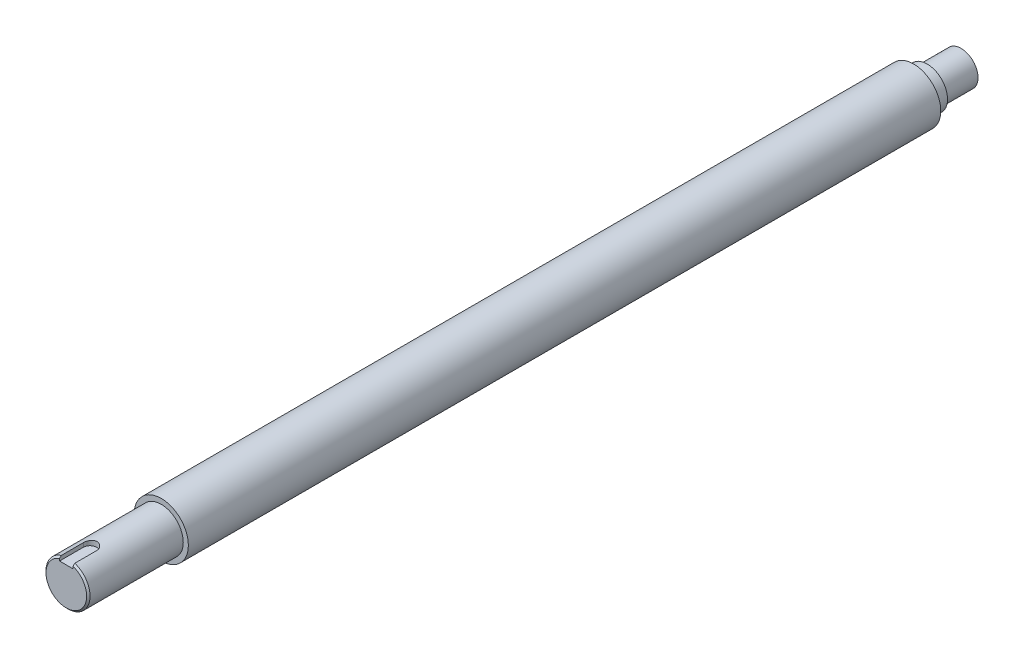
ISO-10303-21;
HEADER;
FILE_DESCRIPTION(('STEP AP214'),'2;1');
FILE_NAME('part.step','',(''),(''),'','','');
FILE_SCHEMA(('AUTOMOTIVE_DESIGN { 1 0 10303 214 1 1 1 1 }'));
ENDSEC;
DATA;
#1=APPLICATION_CONTEXT('core data for automotive mechanical design processes');
#2=APPLICATION_PROTOCOL_DEFINITION('international standard','automotive_design',2000,#1);
#3=PRODUCT_CONTEXT('',#1,'mechanical');
#4=PRODUCT('Part','Part','',(#3));
#5=PRODUCT_RELATED_PRODUCT_CATEGORY('part','',(#4));
#6=PRODUCT_DEFINITION_FORMATION('','',#4);
#7=PRODUCT_DEFINITION_CONTEXT('part definition',#1,'design');
#8=PRODUCT_DEFINITION('design','',#6,#7);
#9=PRODUCT_DEFINITION_SHAPE('','',#8);
#10=(LENGTH_UNIT() NAMED_UNIT(*) SI_UNIT(.MILLI.,.METRE.));
#11=(NAMED_UNIT(*) PLANE_ANGLE_UNIT() SI_UNIT($,.RADIAN.));
#12=(NAMED_UNIT(*) SI_UNIT($,.STERADIAN.) SOLID_ANGLE_UNIT());
#13=UNCERTAINTY_MEASURE_WITH_UNIT(LENGTH_MEASURE(1.E-05),#10,'distance_accuracy_value','');
#14=(GEOMETRIC_REPRESENTATION_CONTEXT(3) GLOBAL_UNCERTAINTY_ASSIGNED_CONTEXT((#13)) GLOBAL_UNIT_ASSIGNED_CONTEXT((#10,
#11,#12)) REPRESENTATION_CONTEXT('',''));
#15=CARTESIAN_POINT('',(0.,0.,0.));
#16=DIRECTION('',(0.,0.,1.));
#17=DIRECTION('',(1.,0.,0.));
#18=AXIS2_PLACEMENT_3D('',#15,#16,#17);
#19=CARTESIAN_POINT('',(0.,0.,-59.));
#20=DIRECTION('',(0.,0.,-1.));
#21=DIRECTION('',(-1.,0.,0.));
#22=AXIS2_PLACEMENT_3D('',#19,#20,#21);
#23=CYLINDRICAL_SURFACE('',#22,3.);
#24=CARTESIAN_POINT('',(0.,0.,-59.));
#25=DIRECTION('',(0.,0.,-1.));
#26=DIRECTION('',(-1.,0.,0.));
#27=AXIS2_PLACEMENT_3D('',#24,#25,#26);
#28=CIRCLE('',#27,3.);
#29=CARTESIAN_POINT('',(-3.,0.,-59.));
#30=VERTEX_POINT('',#29);
#31=EDGE_CURVE('E208',#30,#30,#28,.T.);
#32=ORIENTED_EDGE('',*,*,#31,.T.);
#33=EDGE_LOOP('',(#32));
#34=FACE_BOUND('',#33,.T.);
#35=CARTESIAN_POINT('',(0.,0.,-61.));
#36=DIRECTION('',(0.,0.,-1.));
#37=DIRECTION('',(-1.,0.,0.));
#38=AXIS2_PLACEMENT_3D('',#35,#36,#37);
#39=CIRCLE('',#38,3.);
#40=CARTESIAN_POINT('',(-3.,0.,-61.));
#41=VERTEX_POINT('',#40);
#42=EDGE_CURVE('E47',#41,#41,#39,.F.);
#43=ORIENTED_EDGE('',*,*,#42,.T.);
#44=EDGE_LOOP('',(#43));
#45=FACE_BOUND('',#44,.T.);
#46=ADVANCED_FACE('F41',(#34,#45),#23,.T.);
#47=CARTESIAN_POINT('',(0.,0.,66.));
#48=DIRECTION('',(0.,0.,-1.));
#49=DIRECTION('',(-1.,0.,0.));
#50=AXIS2_PLACEMENT_3D('',#47,#48,#49);
#51=CYLINDRICAL_SURFACE('',#50,4.);
#52=CARTESIAN_POINT('',(0.,0.,52.));
#53=DIRECTION('',(0.,0.,1.));
#54=DIRECTION('',(1.,0.,0.));
#55=AXIS2_PLACEMENT_3D('',#52,#53,#54);
#56=CIRCLE('',#55,4.);
#57=CARTESIAN_POINT('',(4.,0.,52.));
#58=VERTEX_POINT('',#57);
#59=EDGE_CURVE('E253',#58,#58,#56,.T.);
#60=ORIENTED_EDGE('',*,*,#59,.F.);
#61=EDGE_LOOP('',(#60));
#62=FACE_BOUND('',#61,.T.);
#63=CARTESIAN_POINT('',(0.,0.,-59.));
#64=DIRECTION('',(0.,0.,-1.));
#65=DIRECTION('',(-1.,0.,0.));
#66=AXIS2_PLACEMENT_3D('',#63,#64,#65);
#67=CIRCLE('',#66,4.);
#68=CARTESIAN_POINT('',(-4.,0.,-59.));
#69=VERTEX_POINT('',#68);
#70=EDGE_CURVE('E212',#69,#69,#67,.T.);
#71=ORIENTED_EDGE('',*,*,#70,.F.);
#72=EDGE_LOOP('',(#71));
#73=FACE_BOUND('',#72,.T.);
#74=ADVANCED_FACE('F325',(#62,#73),#51,.T.);
#75=CARTESIAN_POINT('',(0.,0.,52.));
#76=DIRECTION('',(0.,0.,1.));
#77=DIRECTION('',(1.,0.,0.));
#78=AXIS2_PLACEMENT_3D('',#75,#76,#77);
#79=PLANE('',#78);
#80=CARTESIAN_POINT('',(0.,0.,52.));
#81=DIRECTION('',(0.,0.,1.));
#82=DIRECTION('',(1.,0.,0.));
#83=AXIS2_PLACEMENT_3D('',#80,#81,#82);
#84=CIRCLE('',#83,3.25);
#85=CARTESIAN_POINT('',(3.25,0.,52.));
#86=VERTEX_POINT('',#85);
#87=EDGE_CURVE('E249',#86,#86,#84,.T.);
#88=ORIENTED_EDGE('',*,*,#87,.F.);
#89=EDGE_LOOP('',(#88));
#90=FACE_BOUND('',#89,.T.);
#91=ORIENTED_EDGE('',*,*,#59,.T.);
#92=EDGE_LOOP('',(#91));
#93=FACE_BOUND('',#92,.T.);
#94=ADVANCED_FACE('F331',(#90,#93),#79,.T.);
#95=CARTESIAN_POINT('',(0.,0.,52.));
#96=DIRECTION('',(0.,0.,1.));
#97=DIRECTION('',(1.,0.,0.));
#98=AXIS2_PLACEMENT_3D('',#95,#96,#97);
#99=CYLINDRICAL_SURFACE('',#98,3.25);
#100=DIRECTION('',(0.,0.,1.));
#101=VECTOR('',#100,1.);
#102=CARTESIAN_POINT('',(0.999999999999998,3.09232921921325,52.));
#103=LINE('',#102,#101);
#104=CARTESIAN_POINT('',(0.999999999999998,3.09232921921325,65.75));
#105=VERTEX_POINT('',#104);
#106=CARTESIAN_POINT('',(1.,3.09232921921325,62.5));
#107=VERTEX_POINT('',#106);
#108=EDGE_CURVE('E246',#105,#107,#103,.F.);
#109=ORIENTED_EDGE('',*,*,#108,.F.);
#110=CARTESIAN_POINT('',(0.,0.,65.75));
#111=DIRECTION('',(0.,0.,1.));
#112=DIRECTION('',(1.,0.,0.));
#113=AXIS2_PLACEMENT_3D('',#110,#111,#112);
#114=CIRCLE('',#113,3.25);
#115=CARTESIAN_POINT('',(-1.,3.09232921921325,65.75));
#116=VERTEX_POINT('',#115);
#117=EDGE_CURVE('E53',#105,#116,#114,.F.);
#118=ORIENTED_EDGE('',*,*,#117,.T.);
#119=DIRECTION('',(0.,0.,1.));
#120=VECTOR('',#119,1.);
#121=CARTESIAN_POINT('',(-1.,3.09232921921325,52.));
#122=LINE('',#121,#120);
#123=CARTESIAN_POINT('',(-1.,3.09232921921325,62.5));
#124=VERTEX_POINT('',#123);
#125=EDGE_CURVE('E232',#124,#116,#122,.T.);
#126=ORIENTED_EDGE('',*,*,#125,.F.);
#127=CARTESIAN_POINT('',(1.,3.09232921921325,62.5));
#128=CARTESIAN_POINT('',(1.00000060849596,3.09232679496023,62.4725829497504));
#129=CARTESIAN_POINT('',(0.998871734792141,3.09269430709658,62.4451797499895));
#130=CARTESIAN_POINT('',(0.994373412064609,3.0941444484278,62.3905832737382));
#131=CARTESIAN_POINT('',(0.991004488865656,3.09522690979651,62.3633899494972));
#132=CARTESIAN_POINT('',(0.977595798696109,3.09949986780655,62.2825678150966));
#133=CARTESIAN_POINT('',(0.964253807107649,3.10371628374243,62.2295023728819));
#134=CARTESIAN_POINT('',(0.929228381659052,3.11438030643292,62.1265060146676));
#135=CARTESIAN_POINT('',(0.907548236778259,3.12082703334217,62.0765738717617));
#136=CARTESIAN_POINT('',(0.856500010775838,3.13522074286848,61.9810176285365));
#137=CARTESIAN_POINT('',(0.827128097492383,3.14316847275732,61.9353956910912));
#138=CARTESIAN_POINT('',(0.760493273359017,3.15996243444553,61.848273334789));
#139=CARTESIAN_POINT('',(0.723020102927358,3.16882846589433,61.8069375813687));
#140=CARTESIAN_POINT('',(0.641694254495179,3.18629188883384,61.7310245522188));
#141=CARTESIAN_POINT('',(0.597840488986,3.19488923422564,61.6964484309602));
#142=CARTESIAN_POINT('',(0.503813866067312,3.21107350257153,61.6343124865832));
#143=CARTESIAN_POINT('',(0.453523821065542,3.21863422678888,61.6069225781337));
#144=CARTESIAN_POINT('',(0.348781013050185,3.23166087940009,61.561054781655));
#145=CARTESIAN_POINT('',(0.294329371654429,3.2371273698525,61.5425745020803));
#146=CARTESIAN_POINT('',(0.184539950762737,3.2452091704307,61.5155997760943));
#147=CARTESIAN_POINT('',(0.129277690188,3.24790505255448,61.5068225402275));
#148=CARTESIAN_POINT('',(0.0180023906652296,3.25042616236987,61.4986076870213));
#149=CARTESIAN_POINT('',(-0.0380104957837585,3.25025196457789,61.4991682005041));
#150=CARTESIAN_POINT('',(-0.147207085626814,3.24710886024715,61.5094258046145));
#151=CARTESIAN_POINT('',(-0.2004227176965,3.24423373696301,61.5188163052281));
#152=CARTESIAN_POINT('',(-0.304481827411612,3.23612670060402,61.5459649990141));
#153=CARTESIAN_POINT('',(-0.355325178541679,3.23089466199145,61.5637236379056));
#154=CARTESIAN_POINT('',(-0.453913277359841,3.21853426865844,61.6073057352098));
#155=CARTESIAN_POINT('',(-0.501613403920564,3.21138386383479,61.6332236200848));
#156=CARTESIAN_POINT('',(-0.592083305838225,3.19594221724746,61.692313030734));
#157=CARTESIAN_POINT('',(-0.634851917166405,3.18765070714765,61.7254862637209));
#158=CARTESIAN_POINT('',(-0.716070212245402,3.17041599968066,61.7997208296557));
#159=CARTESIAN_POINT('',(-0.754275837989609,3.16146000668147,61.8410465424395));
#160=CARTESIAN_POINT('',(-0.823293213934759,3.14419427267491,61.9296138436671));
#161=CARTESIAN_POINT('',(-0.854102765456965,3.13588472433531,61.9768571849465));
#162=CARTESIAN_POINT('',(-0.90773009492845,3.12078732478245,62.0765989009247));
#163=CARTESIAN_POINT('',(-0.930455726353123,3.11401731778575,62.1291496118682));
#164=CARTESIAN_POINT('',(-0.966633025095809,3.10297988745074,62.2375619076414));
#165=CARTESIAN_POINT('',(-0.980098962678475,3.09870861479558,62.2934182531513));
#166=CARTESIAN_POINT('',(-0.992455073788097,3.09476092233738,62.3748352416119));
#167=CARTESIAN_POINT('',(-0.995283915242962,3.09385116848617,62.3997932990799));
#168=CARTESIAN_POINT('',(-0.999054782773968,3.09263516553557,62.4498299673661));
#169=CARTESIAN_POINT('',(-0.999999517882651,3.09232804995251,62.4749083530511));
#170=CARTESIAN_POINT('',(-1.,3.09232921921325,62.5));
#171=B_SPLINE_CURVE_WITH_KNOTS('',3,(#127,#128,#129,#130,#131,#132,#133,#134,#135,#136,#137,
#138,#139,#140,#141,#142,#143,#144,#145,#146,#147,#148,#149,#150,#151,#152,#153,#154,#155,#156,
#157,#158,#159,#160,#161,#162,#163,#164,#165,#166,#167,#168,#169,#170),.UNSPECIFIED.,.F.,.F.,(4,
2,2,2,2,2,2,2,2,2,2,2,2,2,2,2,2,2,2,2,2,4),(0.,0.0821983553007942,0.164377422331977,
0.328159871578877,0.491877783090292,0.655677417175074,0.82439008821497,0.993131548401804,
1.16556201072749,1.33794616302356,1.50516176736448,1.67234389983585,1.8339275148169,
1.99551973733562,2.15905542194855,2.32262962864499,2.4928073537685,2.66303560624824,
2.83514636286236,3.0069912787304,3.08232880746056,3.15755793499273),.UNSPECIFIED.);
#172=EDGE_CURVE('E261',#107,#124,#171,.T.);
#173=ORIENTED_EDGE('',*,*,#172,.F.);
#174=EDGE_LOOP('',(#109,#118,#126,#173));
#175=FACE_BOUND('',#174,.T.);
#176=ORIENTED_EDGE('',*,*,#87,.T.);
#177=EDGE_LOOP('',(#176));
#178=FACE_BOUND('',#177,.T.);
#179=ADVANCED_FACE('F272',(#175,#178),#99,.T.);
#180=CARTESIAN_POINT('',(0.,0.,66.));
#181=DIRECTION('',(0.,0.,1.));
#182=DIRECTION('',(1.,0.,0.));
#183=AXIS2_PLACEMENT_3D('',#180,#181,#182);
#184=PLANE('',#183);
#185=DIRECTION('',(0.,1.,0.));
#186=VECTOR('',#185,1.);
#187=CARTESIAN_POINT('',(-1.,2.5,66.));
#188=LINE('',#187,#186);
#189=CARTESIAN_POINT('',(-1.,2.5,66.));
#190=VERTEX_POINT('',#189);
#191=CARTESIAN_POINT('',(-1.,2.82842712474618,66.));
#192=VERTEX_POINT('',#191);
#193=EDGE_CURVE('E237',#190,#192,#188,.T.);
#194=ORIENTED_EDGE('',*,*,#193,.T.);
#195=CARTESIAN_POINT('',(0.,0.,66.));
#196=DIRECTION('',(0.,0.,1.));
#197=DIRECTION('',(1.,0.,0.));
#198=AXIS2_PLACEMENT_3D('',#195,#196,#197);
#199=CIRCLE('',#198,2.99999999999999);
#200=CARTESIAN_POINT('',(1.,2.82842712474618,66.));
#201=VERTEX_POINT('',#200);
#202=EDGE_CURVE('E270',#192,#201,#199,.T.);
#203=ORIENTED_EDGE('',*,*,#202,.T.);
#204=DIRECTION('',(0.,1.,0.));
#205=VECTOR('',#204,1.);
#206=CARTESIAN_POINT('',(1.,2.5,66.));
#207=LINE('',#206,#205);
#208=CARTESIAN_POINT('',(1.,2.5,66.));
#209=VERTEX_POINT('',#208);
#210=EDGE_CURVE('E233',#209,#201,#207,.T.);
#211=ORIENTED_EDGE('',*,*,#210,.F.);
#212=DIRECTION('',(-1.,0.,0.));
#213=VECTOR('',#212,1.);
#214=CARTESIAN_POINT('',(0.,2.5,66.));
#215=LINE('',#214,#213);
#216=EDGE_CURVE('E257',#209,#190,#215,.T.);
#217=ORIENTED_EDGE('',*,*,#216,.T.);
#218=EDGE_LOOP('',(#194,#203,#211,#217));
#219=FACE_BOUND('',#218,.T.);
#220=ADVANCED_FACE('F280',(#219),#184,.T.);
#221=CARTESIAN_POINT('',(0.,2.5,62.5));
#222=DIRECTION('',(0.,1.,0.));
#223=DIRECTION('',(0.,0.,1.));
#224=AXIS2_PLACEMENT_3D('',#221,#222,#223);
#225=CYLINDRICAL_SURFACE('',#224,1.);
#226=ORIENTED_EDGE('',*,*,#172,.T.);
#227=DIRECTION('',(0.,1.,0.));
#228=VECTOR('',#227,1.);
#229=CARTESIAN_POINT('',(-1.,2.5,62.5));
#230=LINE('',#229,#228);
#231=CARTESIAN_POINT('',(-1.,2.5,62.5));
#232=VERTEX_POINT('',#231);
#233=EDGE_CURVE('E227',#232,#124,#230,.T.);
#234=ORIENTED_EDGE('',*,*,#233,.F.);
#235=CARTESIAN_POINT('',(0.,2.5,62.5));
#236=DIRECTION('',(0.,1.,0.));
#237=DIRECTION('',(0.,0.,1.));
#238=AXIS2_PLACEMENT_3D('',#235,#236,#237);
#239=CIRCLE('',#238,1.);
#240=CARTESIAN_POINT('',(1.,2.5,62.5));
#241=VERTEX_POINT('',#240);
#242=EDGE_CURVE('E216',#241,#232,#239,.T.);
#243=ORIENTED_EDGE('',*,*,#242,.F.);
#244=DIRECTION('',(0.,1.,0.));
#245=VECTOR('',#244,1.);
#246=CARTESIAN_POINT('',(1.,2.5,62.5));
#247=LINE('',#246,#245);
#248=EDGE_CURVE('E228',#241,#107,#247,.T.);
#249=ORIENTED_EDGE('',*,*,#248,.T.);
#250=EDGE_LOOP('',(#226,#234,#243,#249));
#251=FACE_BOUND('',#250,.T.);
#252=ADVANCED_FACE('F275',(#251),#225,.F.);
#253=CARTESIAN_POINT('',(1.,2.5,62.5));
#254=DIRECTION('',(1.,0.,0.));
#255=DIRECTION('',(0.,0.,-1.));
#256=AXIS2_PLACEMENT_3D('',#253,#254,#255);
#257=PLANE('',#256);
#258=ORIENTED_EDGE('',*,*,#210,.T.);
#259=CARTESIAN_POINT('',(1.,2.82842712474618,66.));
#260=CARTESIAN_POINT('',(1.,2.87250592790964,65.9584337390049));
#261=CARTESIAN_POINT('',(1.,2.91653717184066,65.9168172740856));
#262=CARTESIAN_POINT('',(1.,3.0045045366531,65.8334839407418));
#263=CARTESIAN_POINT('',(1.,3.04844065754444,65.7917670723278));
#264=CARTESIAN_POINT('',(1.,3.09232921921324,65.75));
#265=B_SPLINE_CURVE_WITH_KNOTS('',3,(#259,#260,#261,#262,#263,#264),.UNSPECIFIED.,.F.,.F.,(4,2,
4),(0.,0.181758425803132,0.363516832660342),.UNSPECIFIED.);
#266=EDGE_CURVE('E296',#201,#105,#265,.T.);
#267=ORIENTED_EDGE('',*,*,#266,.T.);
#268=ORIENTED_EDGE('',*,*,#108,.T.);
#269=ORIENTED_EDGE('',*,*,#248,.F.);
#270=DIRECTION('',(0.,0.,-1.));
#271=VECTOR('',#270,1.);
#272=CARTESIAN_POINT('',(1.,2.5,62.5));
#273=LINE('',#272,#271);
#274=EDGE_CURVE('E223',#209,#241,#273,.T.);
#275=ORIENTED_EDGE('',*,*,#274,.F.);
#276=EDGE_LOOP('',(#258,#267,#268,#269,#275));
#277=FACE_BOUND('',#276,.T.);
#278=ADVANCED_FACE('F279',(#277),#257,.F.);
#279=CARTESIAN_POINT('',(-1.,2.5,62.5));
#280=DIRECTION('',(-1.,0.,0.));
#281=DIRECTION('',(0.,0.,1.));
#282=AXIS2_PLACEMENT_3D('',#279,#280,#281);
#283=PLANE('',#282);
#284=ORIENTED_EDGE('',*,*,#125,.T.);
#285=CARTESIAN_POINT('',(-1.,3.09232921921325,65.75));
#286=CARTESIAN_POINT('',(-1.,3.04844065754444,65.7917670723278));
#287=CARTESIAN_POINT('',(-1.,3.0045045366531,65.8334839407418));
#288=CARTESIAN_POINT('',(-1.,2.91653717184066,65.9168172740856));
#289=CARTESIAN_POINT('',(-1.,2.87250592790964,65.9584337390049));
#290=CARTESIAN_POINT('',(-1.,2.82842712474618,66.));
#291=B_SPLINE_CURVE_WITH_KNOTS('',3,(#285,#286,#287,#288,#289,#290),.UNSPECIFIED.,.F.,.F.,(4,2,
4),(0.,0.181758406857212,0.363516832660345),.UNSPECIFIED.);
#292=EDGE_CURVE('E11',#116,#192,#291,.T.);
#293=ORIENTED_EDGE('',*,*,#292,.T.);
#294=ORIENTED_EDGE('',*,*,#193,.F.);
#295=DIRECTION('',(0.,0.,1.));
#296=VECTOR('',#295,1.);
#297=CARTESIAN_POINT('',(-1.,2.5,62.5));
#298=LINE('',#297,#296);
#299=EDGE_CURVE('E220',#232,#190,#298,.T.);
#300=ORIENTED_EDGE('',*,*,#299,.F.);
#301=ORIENTED_EDGE('',*,*,#233,.T.);
#302=EDGE_LOOP('',(#284,#293,#294,#300,#301));
#303=FACE_BOUND('',#302,.T.);
#304=ADVANCED_FACE('F282',(#303),#283,.F.);
#305=CARTESIAN_POINT('',(0.,2.5,62.5));
#306=DIRECTION('',(0.,1.,0.));
#307=DIRECTION('',(0.,0.,1.));
#308=AXIS2_PLACEMENT_3D('',#305,#306,#307);
#309=PLANE('',#308);
#310=ORIENTED_EDGE('',*,*,#274,.T.);
#311=ORIENTED_EDGE('',*,*,#242,.T.);
#312=ORIENTED_EDGE('',*,*,#299,.T.);
#313=ORIENTED_EDGE('',*,*,#216,.F.);
#314=EDGE_LOOP('',(#310,#311,#312,#313));
#315=FACE_BOUND('',#314,.T.);
#316=ADVANCED_FACE('F286',(#315),#309,.T.);
#317=CARTESIAN_POINT('',(0.,0.,66.));
#318=DIRECTION('',(0.,0.,-1.));
#319=DIRECTION('',(-1.,0.,0.));
#320=AXIS2_PLACEMENT_3D('',#317,#318,#319);
#321=CONICAL_SURFACE('',#320,2.99999999999999,0.785398163397415);
#322=ORIENTED_EDGE('',*,*,#292,.F.);
#323=ORIENTED_EDGE('',*,*,#117,.F.);
#324=ORIENTED_EDGE('',*,*,#266,.F.);
#325=ORIENTED_EDGE('',*,*,#202,.F.);
#326=EDGE_LOOP('',(#322,#323,#324,#325));
#327=FACE_BOUND('',#326,.T.);
#328=ADVANCED_FACE('F44',(#327),#321,.T.);
#329=CARTESIAN_POINT('',(0.,0.,-59.));
#330=DIRECTION('',(0.,0.,-1.));
#331=DIRECTION('',(-1.,0.,0.));
#332=AXIS2_PLACEMENT_3D('',#329,#330,#331);
#333=PLANE('',#332);
#334=ORIENTED_EDGE('',*,*,#31,.F.);
#335=EDGE_LOOP('',(#334));
#336=FACE_BOUND('',#335,.T.);
#337=ORIENTED_EDGE('',*,*,#70,.T.);
#338=EDGE_LOOP('',(#337));
#339=FACE_BOUND('',#338,.T.);
#340=ADVANCED_FACE('F316',(#336,#339),#333,.T.);
#341=CARTESIAN_POINT('',(0.,0.,-61.));
#342=DIRECTION('',(0.,0.,-1.));
#343=DIRECTION('',(-1.,0.,0.));
#344=AXIS2_PLACEMENT_3D('',#341,#342,#343);
#345=PLANE('',#344);
#346=ORIENTED_EDGE('',*,*,#42,.F.);
#347=EDGE_LOOP('',(#346));
#348=FACE_BOUND('',#347,.T.);
#349=CARTESIAN_POINT('',(0.,0.,-61.));
#350=DIRECTION('',(0.,0.,-1.));
#351=DIRECTION('',(-1.,0.,0.));
#352=AXIS2_PLACEMENT_3D('',#349,#350,#351);
#353=CIRCLE('',#352,2.5);
#354=CARTESIAN_POINT('',(-2.5,0.,-61.));
#355=VERTEX_POINT('',#354);
#356=EDGE_CURVE('E201',#355,#355,#353,.T.);
#357=ORIENTED_EDGE('',*,*,#356,.F.);
#358=EDGE_LOOP('',(#357));
#359=FACE_BOUND('',#358,.T.);
#360=ADVANCED_FACE('F321',(#348,#359),#345,.T.);
#361=CARTESIAN_POINT('',(0.,0.,-61.));
#362=DIRECTION('',(0.,0.,-1.));
#363=DIRECTION('',(-1.,0.,0.));
#364=AXIS2_PLACEMENT_3D('',#361,#362,#363);
#365=CYLINDRICAL_SURFACE('',#364,2.5);
#366=ORIENTED_EDGE('',*,*,#356,.T.);
#367=EDGE_LOOP('',(#366));
#368=FACE_BOUND('',#367,.T.);
#369=CARTESIAN_POINT('',(0.,0.,-66.));
#370=DIRECTION('',(0.,0.,-1.));
#371=DIRECTION('',(-1.,0.,0.));
#372=AXIS2_PLACEMENT_3D('',#369,#370,#371);
#373=CIRCLE('',#372,2.5);
#374=CARTESIAN_POINT('',(-2.5,0.,-66.));
#375=VERTEX_POINT('',#374);
#376=EDGE_CURVE('E189',#375,#375,#373,.T.);
#377=ORIENTED_EDGE('',*,*,#376,.F.);
#378=EDGE_LOOP('',(#377));
#379=FACE_BOUND('',#378,.T.);
#380=ADVANCED_FACE('F337',(#368,#379),#365,.T.);
#381=CARTESIAN_POINT('',(0.,0.,-66.));
#382=DIRECTION('',(0.,0.,1.));
#383=DIRECTION('',(1.,0.,0.));
#384=AXIS2_PLACEMENT_3D('',#381,#382,#383);
#385=PLANE('',#384);
#386=DIRECTION('',(-0.5,0.866025403784439,0.));
#387=VECTOR('',#386,1.);
#388=CARTESIAN_POINT('',(-0.75,-1.29903810567666,-66.));
#389=LINE('',#388,#387);
#390=CARTESIAN_POINT('',(-0.75,-1.29903810567666,-66.));
#391=VERTEX_POINT('',#390);
#392=CARTESIAN_POINT('',(-1.5,0.,-66.));
#393=VERTEX_POINT('',#392);
#394=EDGE_CURVE('E172',#391,#393,#389,.T.);
#395=ORIENTED_EDGE('',*,*,#394,.F.);
#396=DIRECTION('',(-1.,0.,0.));
#397=VECTOR('',#396,1.);
#398=CARTESIAN_POINT('',(0.75,-1.29903810567666,-66.));
#399=LINE('',#398,#397);
#400=CARTESIAN_POINT('',(0.75,-1.29903810567666,-66.));
#401=VERTEX_POINT('',#400);
#402=EDGE_CURVE('E60',#401,#391,#399,.T.);
#403=ORIENTED_EDGE('',*,*,#402,.F.);
#404=DIRECTION('',(-0.5,-0.866025403784439,0.));
#405=VECTOR('',#404,1.);
#406=CARTESIAN_POINT('',(1.5,0.,-66.));
#407=LINE('',#406,#405);
#408=CARTESIAN_POINT('',(1.5,0.,-66.));
#409=VERTEX_POINT('',#408);
#410=EDGE_CURVE('E152',#409,#401,#407,.T.);
#411=ORIENTED_EDGE('',*,*,#410,.F.);
#412=DIRECTION('',(0.5,-0.866025403784439,0.));
#413=VECTOR('',#412,1.);
#414=CARTESIAN_POINT('',(0.75,1.29903810567666,-66.));
#415=LINE('',#414,#413);
#416=CARTESIAN_POINT('',(0.75,1.29903810567666,-66.));
#417=VERTEX_POINT('',#416);
#418=EDGE_CURVE('E156',#417,#409,#415,.T.);
#419=ORIENTED_EDGE('',*,*,#418,.F.);
#420=DIRECTION('',(1.,0.,0.));
#421=VECTOR('',#420,1.);
#422=CARTESIAN_POINT('',(-0.75,1.29903810567666,-66.));
#423=LINE('',#422,#421);
#424=CARTESIAN_POINT('',(-0.75,1.29903810567666,-66.));
#425=VERTEX_POINT('',#424);
#426=EDGE_CURVE('E179',#425,#417,#423,.T.);
#427=ORIENTED_EDGE('',*,*,#426,.F.);
#428=DIRECTION('',(0.5,0.866025403784439,0.));
#429=VECTOR('',#428,1.);
#430=CARTESIAN_POINT('',(-1.5,0.,-66.));
#431=LINE('',#430,#429);
#432=EDGE_CURVE('E175',#393,#425,#431,.T.);
#433=ORIENTED_EDGE('',*,*,#432,.F.);
#434=EDGE_LOOP('',(#395,#403,#411,#419,#427,#433));
#435=FACE_BOUND('',#434,.T.);
#436=ORIENTED_EDGE('',*,*,#376,.T.);
#437=EDGE_LOOP('',(#436));
#438=FACE_BOUND('',#437,.T.);
#439=ADVANCED_FACE('F341',(#435,#438),#385,.F.);
#440=CARTESIAN_POINT('',(0.75,-1.29903810567666,-61.));
#441=DIRECTION('',(0.,-1.,0.));
#442=DIRECTION('',(1.,0.,0.));
#443=AXIS2_PLACEMENT_3D('',#440,#441,#442);
#444=PLANE('',#443);
#445=ORIENTED_EDGE('',*,*,#402,.T.);
#446=DIRECTION('',(0.,0.,-1.));
#447=VECTOR('',#446,1.);
#448=CARTESIAN_POINT('',(-0.75,-1.29903810567666,-61.));
#449=LINE('',#448,#447);
#450=CARTESIAN_POINT('',(-0.75,-1.29903810567666,-61.));
#451=VERTEX_POINT('',#450);
#452=EDGE_CURVE('E126',#451,#391,#449,.T.);
#453=ORIENTED_EDGE('',*,*,#452,.F.);
#454=DIRECTION('',(-1.,0.,0.));
#455=VECTOR('',#454,1.);
#456=CARTESIAN_POINT('',(0.75,-1.29903810567666,-61.));
#457=LINE('',#456,#455);
#458=CARTESIAN_POINT('',(0.75,-1.29903810567666,-61.));
#459=VERTEX_POINT('',#458);
#460=EDGE_CURVE('E130',#459,#451,#457,.T.);
#461=ORIENTED_EDGE('',*,*,#460,.F.);
#462=DIRECTION('',(0.,0.,-1.));
#463=VECTOR('',#462,1.);
#464=CARTESIAN_POINT('',(0.75,-1.29903810567666,-61.));
#465=LINE('',#464,#463);
#466=EDGE_CURVE('E186',#459,#401,#465,.T.);
#467=ORIENTED_EDGE('',*,*,#466,.T.);
#468=EDGE_LOOP('',(#445,#453,#461,#467));
#469=FACE_BOUND('',#468,.T.);
#470=ADVANCED_FACE('F128',(#469),#444,.F.);
#471=CARTESIAN_POINT('',(1.5,0.,-61.));
#472=DIRECTION('',(0.866025403784439,-0.5,0.));
#473=DIRECTION('',(0.5,0.866025403784439,0.));
#474=AXIS2_PLACEMENT_3D('',#471,#472,#473);
#475=PLANE('',#474);
#476=ORIENTED_EDGE('',*,*,#410,.T.);
#477=ORIENTED_EDGE('',*,*,#466,.F.);
#478=DIRECTION('',(-0.5,-0.866025403784439,0.));
#479=VECTOR('',#478,1.);
#480=CARTESIAN_POINT('',(1.5,0.,-61.));
#481=LINE('',#480,#479);
#482=CARTESIAN_POINT('',(1.5,0.,-61.));
#483=VERTEX_POINT('',#482);
#484=EDGE_CURVE('E137',#483,#459,#481,.T.);
#485=ORIENTED_EDGE('',*,*,#484,.F.);
#486=DIRECTION('',(0.,0.,-1.));
#487=VECTOR('',#486,1.);
#488=CARTESIAN_POINT('',(1.5,0.,-61.));
#489=LINE('',#488,#487);
#490=EDGE_CURVE('E190',#483,#409,#489,.T.);
#491=ORIENTED_EDGE('',*,*,#490,.T.);
#492=EDGE_LOOP('',(#476,#477,#485,#491));
#493=FACE_BOUND('',#492,.T.);
#494=ADVANCED_FACE('F345',(#493),#475,.F.);
#495=CARTESIAN_POINT('',(0.75,1.29903810567666,-61.));
#496=DIRECTION('',(0.866025403784439,0.5,0.));
#497=DIRECTION('',(-0.5,0.866025403784439,0.));
#498=AXIS2_PLACEMENT_3D('',#495,#496,#497);
#499=PLANE('',#498);
#500=ORIENTED_EDGE('',*,*,#418,.T.);
#501=ORIENTED_EDGE('',*,*,#490,.F.);
#502=DIRECTION('',(0.5,-0.866025403784439,0.));
#503=VECTOR('',#502,1.);
#504=CARTESIAN_POINT('',(0.75,1.29903810567666,-61.));
#505=LINE('',#504,#503);
#506=CARTESIAN_POINT('',(0.75,1.29903810567666,-61.));
#507=VERTEX_POINT('',#506);
#508=EDGE_CURVE('E165',#507,#483,#505,.T.);
#509=ORIENTED_EDGE('',*,*,#508,.F.);
#510=DIRECTION('',(0.,0.,-1.));
#511=VECTOR('',#510,1.);
#512=CARTESIAN_POINT('',(0.75,1.29903810567666,-61.));
#513=LINE('',#512,#511);
#514=EDGE_CURVE('E193',#507,#417,#513,.T.);
#515=ORIENTED_EDGE('',*,*,#514,.T.);
#516=EDGE_LOOP('',(#500,#501,#509,#515));
#517=FACE_BOUND('',#516,.T.);
#518=ADVANCED_FACE('F355',(#517),#499,.F.);
#519=CARTESIAN_POINT('',(-0.75,1.29903810567666,-61.));
#520=DIRECTION('',(0.,1.,0.));
#521=DIRECTION('',(0.,0.,1.));
#522=AXIS2_PLACEMENT_3D('',#519,#520,#521);
#523=PLANE('',#522);
#524=ORIENTED_EDGE('',*,*,#426,.T.);
#525=ORIENTED_EDGE('',*,*,#514,.F.);
#526=DIRECTION('',(1.,0.,0.));
#527=VECTOR('',#526,1.);
#528=CARTESIAN_POINT('',(-0.75,1.29903810567666,-61.));
#529=LINE('',#528,#527);
#530=CARTESIAN_POINT('',(-0.75,1.29903810567666,-61.));
#531=VERTEX_POINT('',#530);
#532=EDGE_CURVE('E161',#531,#507,#529,.T.);
#533=ORIENTED_EDGE('',*,*,#532,.F.);
#534=DIRECTION('',(0.,0.,-1.));
#535=VECTOR('',#534,1.);
#536=CARTESIAN_POINT('',(-0.75,1.29903810567666,-61.));
#537=LINE('',#536,#535);
#538=EDGE_CURVE('E196',#531,#425,#537,.T.);
#539=ORIENTED_EDGE('',*,*,#538,.T.);
#540=EDGE_LOOP('',(#524,#525,#533,#539));
#541=FACE_BOUND('',#540,.T.);
#542=ADVANCED_FACE('F351',(#541),#523,.F.);
#543=CARTESIAN_POINT('',(-1.5,0.,-61.));
#544=DIRECTION('',(-0.866025403784439,0.5,0.));
#545=DIRECTION('',(-0.5,-0.866025403784439,0.));
#546=AXIS2_PLACEMENT_3D('',#543,#544,#545);
#547=PLANE('',#546);
#548=ORIENTED_EDGE('',*,*,#432,.T.);
#549=ORIENTED_EDGE('',*,*,#538,.F.);
#550=DIRECTION('',(0.5,0.866025403784439,0.));
#551=VECTOR('',#550,1.);
#552=CARTESIAN_POINT('',(-1.5,0.,-61.));
#553=LINE('',#552,#551);
#554=CARTESIAN_POINT('',(-1.5,0.,-61.));
#555=VERTEX_POINT('',#554);
#556=EDGE_CURVE('E146',#555,#531,#553,.T.);
#557=ORIENTED_EDGE('',*,*,#556,.F.);
#558=DIRECTION('',(0.,0.,-1.));
#559=VECTOR('',#558,1.);
#560=CARTESIAN_POINT('',(-1.5,0.,-61.));
#561=LINE('',#560,#559);
#562=EDGE_CURVE('E136',#555,#393,#561,.T.);
#563=ORIENTED_EDGE('',*,*,#562,.T.);
#564=EDGE_LOOP('',(#548,#549,#557,#563));
#565=FACE_BOUND('',#564,.T.);
#566=ADVANCED_FACE('F348',(#565),#547,.F.);
#567=CARTESIAN_POINT('',(-0.75,-1.29903810567666,-61.));
#568=DIRECTION('',(-0.866025403784439,-0.5,0.));
#569=DIRECTION('',(0.5,-0.866025403784439,0.));
#570=AXIS2_PLACEMENT_3D('',#567,#568,#569);
#571=PLANE('',#570);
#572=ORIENTED_EDGE('',*,*,#394,.T.);
#573=ORIENTED_EDGE('',*,*,#562,.F.);
#574=DIRECTION('',(-0.5,0.866025403784439,0.));
#575=VECTOR('',#574,1.);
#576=CARTESIAN_POINT('',(-0.75,-1.29903810567666,-61.));
#577=LINE('',#576,#575);
#578=EDGE_CURVE('E140',#451,#555,#577,.T.);
#579=ORIENTED_EDGE('',*,*,#578,.F.);
#580=ORIENTED_EDGE('',*,*,#452,.T.);
#581=EDGE_LOOP('',(#572,#573,#579,#580));
#582=FACE_BOUND('',#581,.T.);
#583=ADVANCED_FACE('F141',(#582),#571,.F.);
#584=CARTESIAN_POINT('',(0.,0.,-61.));
#585=DIRECTION('',(0.,0.,-1.));
#586=DIRECTION('',(-1.,0.,0.));
#587=AXIS2_PLACEMENT_3D('',#584,#585,#586);
#588=PLANE('',#587);
#589=ORIENTED_EDGE('',*,*,#460,.T.);
#590=ORIENTED_EDGE('',*,*,#578,.T.);
#591=ORIENTED_EDGE('',*,*,#556,.T.);
#592=ORIENTED_EDGE('',*,*,#532,.T.);
#593=ORIENTED_EDGE('',*,*,#508,.T.);
#594=ORIENTED_EDGE('',*,*,#484,.T.);
#595=EDGE_LOOP('',(#589,#590,#591,#592,#593,#594));
#596=FACE_BOUND('',#595,.T.);
#597=ADVANCED_FACE('F148',(#596),#588,.T.);
#598=CLOSED_SHELL('',(#46,#74,#94,#179,#220,#252,#278,#304,#316,#328,#340,#360,#380,#439,#470,
#494,#518,#542,#566,#583,#597));
#599=MANIFOLD_SOLID_BREP('B2',#598);
#600=ADVANCED_BREP_SHAPE_REPRESENTATION('',(#18,#599),#14);
#601=SHAPE_DEFINITION_REPRESENTATION(#9,#600);
ENDSEC;
END-ISO-10303-21;
